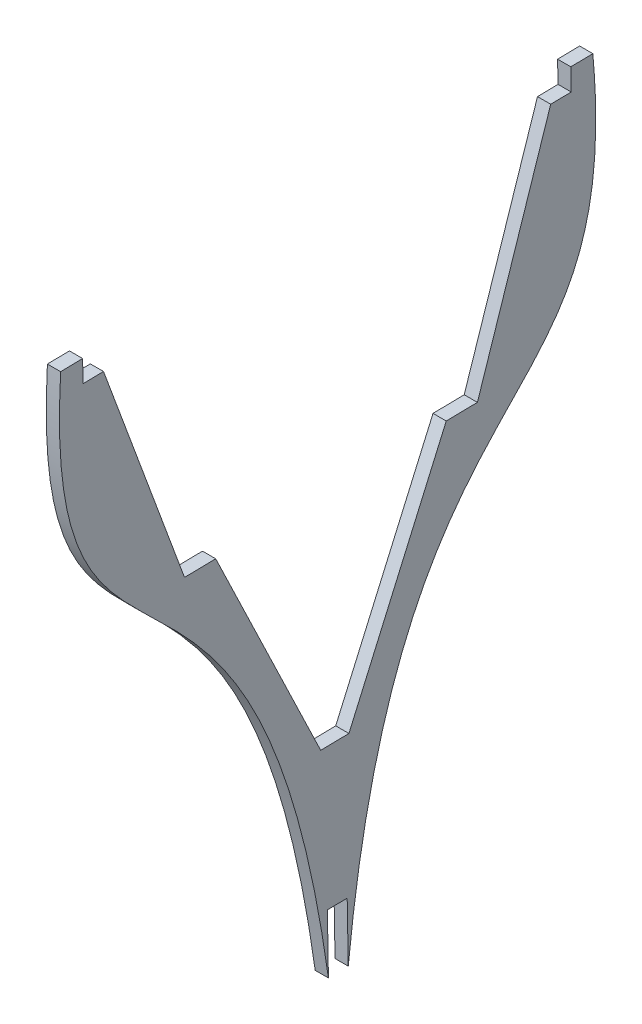
ISO-10303-21;
HEADER;
FILE_DESCRIPTION(('STEP AP214'),'2;1');
FILE_NAME('part.step','',(''),(''),'','','');
FILE_SCHEMA(('AUTOMOTIVE_DESIGN { 1 0 10303 214 1 1 1 1 }'));
ENDSEC;
DATA;
#1=APPLICATION_CONTEXT('core data for automotive mechanical design processes');
#2=APPLICATION_PROTOCOL_DEFINITION('international standard','automotive_design',2000,#1);
#3=PRODUCT_CONTEXT('',#1,'mechanical');
#4=PRODUCT('Part','Part','',(#3));
#5=PRODUCT_RELATED_PRODUCT_CATEGORY('part','',(#4));
#6=PRODUCT_DEFINITION_FORMATION('','',#4);
#7=PRODUCT_DEFINITION_CONTEXT('part definition',#1,'design');
#8=PRODUCT_DEFINITION('design','',#6,#7);
#9=PRODUCT_DEFINITION_SHAPE('','',#8);
#10=(LENGTH_UNIT() NAMED_UNIT(*) SI_UNIT(.MILLI.,.METRE.));
#11=(NAMED_UNIT(*) PLANE_ANGLE_UNIT() SI_UNIT($,.RADIAN.));
#12=(NAMED_UNIT(*) SI_UNIT($,.STERADIAN.) SOLID_ANGLE_UNIT());
#13=UNCERTAINTY_MEASURE_WITH_UNIT(LENGTH_MEASURE(1.E-05),#10,'distance_accuracy_value','');
#14=(GEOMETRIC_REPRESENTATION_CONTEXT(3) GLOBAL_UNCERTAINTY_ASSIGNED_CONTEXT((#13)) GLOBAL_UNIT_ASSIGNED_CONTEXT((#10,
#11,#12)) REPRESENTATION_CONTEXT('',''));
#15=CARTESIAN_POINT('',(0.,0.,0.));
#16=DIRECTION('',(0.,0.,1.));
#17=DIRECTION('',(1.,0.,0.));
#18=AXIS2_PLACEMENT_3D('',#15,#16,#17);
#19=CARTESIAN_POINT('',(6.,367.16431199332,127.304421382329));
#20=CARTESIAN_POINT('',(6.,203.132286892495,136.42399903936));
#21=CARTESIAN_POINT('',(6.,309.477254917197,24.8819117280946));
#22=CARTESIAN_POINT('',(6.,19.6255720457549,0.343298322938901));
#23=B_SPLINE_CURVE_WITH_KNOTS('',3,(#19,#20,#21,#22),.UNSPECIFIED.,.F.,.F.,(4,4),(0.,1.),.UNSPECIFIED.);
#24=DIRECTION('',(-1.,0.,0.));
#25=VECTOR('',#24,1.);
#26=SURFACE_OF_LINEAR_EXTRUSION('',#23,#25);
#27=CARTESIAN_POINT('',(0.,367.16431199332,127.304421382329));
#28=CARTESIAN_POINT('',(0.,203.132286892495,136.42399903936));
#29=CARTESIAN_POINT('',(0.,309.477254917197,24.8819117280946));
#30=CARTESIAN_POINT('',(0.,19.6255720457549,0.343298322938901));
#31=B_SPLINE_CURVE_WITH_KNOTS('',3,(#27,#28,#29,#30),.UNSPECIFIED.,.F.,.F.,(4,4),(0.,1.),.UNSPECIFIED.);
#32=CARTESIAN_POINT('',(0.,367.16431199332,127.304421382329));
#33=VERTEX_POINT('',#32);
#34=CARTESIAN_POINT('',(0.,67.9082996735934,5.68925595323594));
#35=VERTEX_POINT('',#34);
#36=EDGE_CURVE('E179',#33,#35,#31,.T.);
#37=ORIENTED_EDGE('',*,*,#36,.T.);
#38=DIRECTION('',(1.,0.,0.));
#39=VECTOR('',#38,1.);
#40=CARTESIAN_POINT('',(0.,67.9082996735934,5.68925595323594));
#41=LINE('',#40,#39);
#42=CARTESIAN_POINT('',(6.,67.9082996735934,5.68925595323594));
#43=VERTEX_POINT('',#42);
#44=EDGE_CURVE('E185',#35,#43,#41,.T.);
#45=ORIENTED_EDGE('',*,*,#44,.T.);
#46=CARTESIAN_POINT('',(6.,367.16431199332,127.304421382329));
#47=VERTEX_POINT('',#46);
#48=EDGE_CURVE('E219',#47,#43,#23,.T.);
#49=ORIENTED_EDGE('',*,*,#48,.F.);
#50=DIRECTION('',(-1.,0.,0.));
#51=VECTOR('',#50,1.);
#52=CARTESIAN_POINT('',(6.,367.16431199332,127.304421382329));
#53=LINE('',#52,#51);
#54=EDGE_CURVE('E175',#47,#33,#53,.T.);
#55=ORIENTED_EDGE('',*,*,#54,.T.);
#56=EDGE_LOOP('',(#37,#45,#49,#55));
#57=FACE_BOUND('',#56,.T.);
#58=ADVANCED_FACE('F33',(#57),#26,.F.);
#59=CARTESIAN_POINT('',(6.,19.6255720457549,0.343298322938901));
#60=CARTESIAN_POINT('',(6.,310.158145020655,-14.0430025163628));
#61=CARTESIAN_POINT('',(6.,207.779320371727,-129.236169542159));
#62=CARTESIAN_POINT('',(6.,371.392044852877,-114.385299427053));
#63=B_SPLINE_CURVE_WITH_KNOTS('',3,(#59,#60,#61,#62),.UNSPECIFIED.,.F.,.F.,(4,4),(0.,1.),.UNSPECIFIED.);
#64=DIRECTION('',(-1.,0.,0.));
#65=VECTOR('',#64,1.);
#66=SURFACE_OF_LINEAR_EXTRUSION('',#63,#65);
#67=CARTESIAN_POINT('',(6.,68.0657312582242,-3.31074404676406));
#68=VERTEX_POINT('',#67);
#69=CARTESIAN_POINT('',(6.,371.392044852877,-114.385299427053));
#70=VERTEX_POINT('',#69);
#71=EDGE_CURVE('E116',#68,#70,#63,.T.);
#72=ORIENTED_EDGE('',*,*,#71,.F.);
#73=DIRECTION('',(1.,0.,0.));
#74=VECTOR('',#73,1.);
#75=CARTESIAN_POINT('',(0.,68.0657312582242,-3.31074404676406));
#76=LINE('',#75,#74);
#77=CARTESIAN_POINT('',(0.,68.0657312582242,-3.31074404676406));
#78=VERTEX_POINT('',#77);
#79=EDGE_CURVE('E311',#78,#68,#76,.T.);
#80=ORIENTED_EDGE('',*,*,#79,.F.);
#81=CARTESIAN_POINT('',(0.,19.6255720457549,0.343298322938901));
#82=CARTESIAN_POINT('',(0.,310.158145020655,-14.0430025163628));
#83=CARTESIAN_POINT('',(0.,207.779320371727,-129.236169542159));
#84=CARTESIAN_POINT('',(0.,371.392044852877,-114.385299427053));
#85=B_SPLINE_CURVE_WITH_KNOTS('',3,(#81,#82,#83,#84),.UNSPECIFIED.,.F.,.F.,(4,4),(0.,1.),.UNSPECIFIED.);
#86=CARTESIAN_POINT('',(0.,371.392044852877,-114.385299427053));
#87=VERTEX_POINT('',#86);
#88=EDGE_CURVE('E184',#78,#87,#85,.T.);
#89=ORIENTED_EDGE('',*,*,#88,.T.);
#90=DIRECTION('',(-1.,0.,0.));
#91=VECTOR('',#90,1.);
#92=CARTESIAN_POINT('',(6.,371.392044852877,-114.385299427053));
#93=LINE('',#92,#91);
#94=EDGE_CURVE('E11',#70,#87,#93,.T.);
#95=ORIENTED_EDGE('',*,*,#94,.F.);
#96=EDGE_LOOP('',(#72,#80,#89,#95));
#97=FACE_BOUND('',#96,.T.);
#98=ADVANCED_FACE('F323',(#97),#66,.F.);
#99=CARTESIAN_POINT('',(6.,371.392044852877,-114.385299427053));
#100=DIRECTION('',(0.,-0.999847043101869,-0.0174897227093455));
#101=DIRECTION('',(0.,0.0174897227093455,-0.999847043101869));
#102=AXIS2_PLACEMENT_3D('',#99,#100,#101);
#103=PLANE('',#102);
#104=DIRECTION('',(0.,-0.0174897227093455,0.999847043101869));
#105=VECTOR('',#104,1.);
#106=CARTESIAN_POINT('',(0.,371.392044852877,-114.385299427053));
#107=LINE('',#106,#105);
#108=CARTESIAN_POINT('',(0.,371.217120869953,-104.385299427053));
#109=VERTEX_POINT('',#108);
#110=EDGE_CURVE('E192',#87,#109,#107,.T.);
#111=ORIENTED_EDGE('',*,*,#110,.T.);
#112=DIRECTION('',(-1.,0.,0.));
#113=VECTOR('',#112,1.);
#114=CARTESIAN_POINT('',(6.,371.217120869953,-104.385299427053));
#115=LINE('',#114,#113);
#116=CARTESIAN_POINT('',(6.,371.217120869953,-104.385299427053));
#117=VERTEX_POINT('',#116);
#118=EDGE_CURVE('E41',#117,#109,#115,.T.);
#119=ORIENTED_EDGE('',*,*,#118,.F.);
#120=DIRECTION('',(0.,-0.0174897227093455,0.999847043101869));
#121=VECTOR('',#120,1.);
#122=CARTESIAN_POINT('',(6.,371.392044852877,-114.385299427053));
#123=LINE('',#122,#121);
#124=EDGE_CURVE('E305',#70,#117,#123,.T.);
#125=ORIENTED_EDGE('',*,*,#124,.F.);
#126=ORIENTED_EDGE('',*,*,#94,.T.);
#127=EDGE_LOOP('',(#111,#119,#125,#126));
#128=FACE_BOUND('',#127,.T.);
#129=ADVANCED_FACE('F326',(#128),#103,.F.);
#130=CARTESIAN_POINT('',(6.,371.217120869953,-104.385299427053));
#131=DIRECTION('',(0.,0.0174897227093318,-0.999847043101869));
#132=DIRECTION('',(0.,0.999847043101869,0.0174897227093318));
#133=AXIS2_PLACEMENT_3D('',#130,#131,#132);
#134=PLANE('',#133);
#135=DIRECTION('',(0.,-0.999847043101869,-0.0174897227093318));
#136=VECTOR('',#135,1.);
#137=CARTESIAN_POINT('',(0.,371.217120869953,-104.385299427053));
#138=LINE('',#137,#136);
#139=CARTESIAN_POINT('',(0.,361.217120869953,-104.560223409976));
#140=VERTEX_POINT('',#139);
#141=EDGE_CURVE('E197',#109,#140,#138,.T.);
#142=ORIENTED_EDGE('',*,*,#141,.T.);
#143=DIRECTION('',(-1.,0.,0.));
#144=VECTOR('',#143,1.);
#145=CARTESIAN_POINT('',(6.,361.217120869953,-104.560223409976));
#146=LINE('',#145,#144);
#147=CARTESIAN_POINT('',(6.,361.217120869953,-104.560223409976));
#148=VERTEX_POINT('',#147);
#149=EDGE_CURVE('E244',#148,#140,#146,.T.);
#150=ORIENTED_EDGE('',*,*,#149,.F.);
#151=DIRECTION('',(0.,-0.999847043101869,-0.0174897227093318));
#152=VECTOR('',#151,1.);
#153=CARTESIAN_POINT('',(6.,371.217120869953,-104.385299427053));
#154=LINE('',#153,#152);
#155=EDGE_CURVE('E253',#117,#148,#154,.T.);
#156=ORIENTED_EDGE('',*,*,#155,.F.);
#157=ORIENTED_EDGE('',*,*,#118,.T.);
#158=EDGE_LOOP('',(#142,#150,#156,#157));
#159=FACE_BOUND('',#158,.T.);
#160=ADVANCED_FACE('F251',(#159),#134,.F.);
#161=CARTESIAN_POINT('',(6.,361.217120869953,-104.560223409976));
#162=DIRECTION('',(0.,-0.999847043101869,-0.0174897227093329));
#163=DIRECTION('',(0.,0.0174897227093329,-0.999847043101869));
#164=AXIS2_PLACEMENT_3D('',#161,#162,#163);
#165=PLANE('',#164);
#166=DIRECTION('',(0.,-0.0174897227093329,0.999847043101869));
#167=VECTOR('',#166,1.);
#168=CARTESIAN_POINT('',(0.,361.217120869953,-104.560223409976));
#169=LINE('',#168,#167);
#170=CARTESIAN_POINT('',(0.,361.054297197465,-95.2519702037626));
#171=VERTEX_POINT('',#170);
#172=EDGE_CURVE('E199',#140,#171,#169,.T.);
#173=ORIENTED_EDGE('',*,*,#172,.T.);
#174=DIRECTION('',(-1.,0.,0.));
#175=VECTOR('',#174,1.);
#176=CARTESIAN_POINT('',(6.,361.054297197465,-95.2519702037626));
#177=LINE('',#176,#175);
#178=CARTESIAN_POINT('',(6.,361.054297197465,-95.2519702037626));
#179=VERTEX_POINT('',#178);
#180=EDGE_CURVE('E241',#179,#171,#177,.T.);
#181=ORIENTED_EDGE('',*,*,#180,.F.);
#182=DIRECTION('',(0.,-0.0174897227093329,0.999847043101869));
#183=VECTOR('',#182,1.);
#184=CARTESIAN_POINT('',(6.,361.217120869953,-104.560223409976));
#185=LINE('',#184,#183);
#186=EDGE_CURVE('E275',#148,#179,#185,.T.);
#187=ORIENTED_EDGE('',*,*,#186,.F.);
#188=ORIENTED_EDGE('',*,*,#149,.T.);
#189=EDGE_LOOP('',(#173,#181,#187,#188));
#190=FACE_BOUND('',#189,.T.);
#191=ADVANCED_FACE('F266',(#190),#165,.F.);
#192=CARTESIAN_POINT('',(6.,361.054297197465,-95.2519702037626));
#193=DIRECTION('',(0.,-0.314151742452248,-0.949372783849535));
#194=DIRECTION('',(0.,0.949372783849536,-0.314151742452248));
#195=AXIS2_PLACEMENT_3D('',#192,#193,#194);
#196=PLANE('',#195);
#197=DIRECTION('',(0.,-0.949372783849535,0.314151742452248));
#198=VECTOR('',#197,1.);
#199=CARTESIAN_POINT('',(0.,361.054297197465,-95.2519702037626));
#200=LINE('',#199,#198);
#201=CARTESIAN_POINT('',(0.,260.456708777797,-61.9637738006715));
#202=VERTEX_POINT('',#201);
#203=EDGE_CURVE('E201',#171,#202,#200,.T.);
#204=ORIENTED_EDGE('',*,*,#203,.T.);
#205=DIRECTION('',(-1.,0.,0.));
#206=VECTOR('',#205,1.);
#207=CARTESIAN_POINT('',(6.,260.456708777797,-61.9637738006715));
#208=LINE('',#207,#206);
#209=CARTESIAN_POINT('',(6.,260.456708777797,-61.9637738006715));
#210=VERTEX_POINT('',#209);
#211=EDGE_CURVE('E238',#210,#202,#208,.T.);
#212=ORIENTED_EDGE('',*,*,#211,.F.);
#213=DIRECTION('',(0.,-0.949372783849535,0.314151742452248));
#214=VECTOR('',#213,1.);
#215=CARTESIAN_POINT('',(6.,361.054297197465,-95.2519702037626));
#216=LINE('',#215,#214);
#217=EDGE_CURVE('E272',#179,#210,#216,.T.);
#218=ORIENTED_EDGE('',*,*,#217,.F.);
#219=ORIENTED_EDGE('',*,*,#180,.T.);
#220=EDGE_LOOP('',(#204,#212,#218,#219));
#221=FACE_BOUND('',#220,.T.);
#222=ADVANCED_FACE('F270',(#221),#196,.F.);
#223=CARTESIAN_POINT('',(6.,260.456708777797,-61.9637738006715));
#224=DIRECTION('',(0.,-0.999847043101869,-0.0174897227093424));
#225=DIRECTION('',(0.,0.0174897227093424,-0.999847043101869));
#226=AXIS2_PLACEMENT_3D('',#223,#224,#225);
#227=PLANE('',#226);
#228=DIRECTION('',(0.,-0.0174897227093424,0.999847043101869));
#229=VECTOR('',#228,1.);
#230=CARTESIAN_POINT('',(0.,260.456708777797,-61.9637738006715));
#231=LINE('',#230,#229);
#232=CARTESIAN_POINT('',(0.,260.209100036734,-47.808554091817));
#233=VERTEX_POINT('',#232);
#234=EDGE_CURVE('E203',#202,#233,#231,.T.);
#235=ORIENTED_EDGE('',*,*,#234,.T.);
#236=DIRECTION('',(-1.,0.,0.));
#237=VECTOR('',#236,1.);
#238=CARTESIAN_POINT('',(6.,260.209100036734,-47.808554091817));
#239=LINE('',#238,#237);
#240=CARTESIAN_POINT('',(6.,260.209100036734,-47.808554091817));
#241=VERTEX_POINT('',#240);
#242=EDGE_CURVE('E235',#241,#233,#239,.T.);
#243=ORIENTED_EDGE('',*,*,#242,.F.);
#244=DIRECTION('',(0.,-0.0174897227093424,0.999847043101869));
#245=VECTOR('',#244,1.);
#246=CARTESIAN_POINT('',(6.,260.456708777797,-61.9637738006715));
#247=LINE('',#246,#245);
#248=EDGE_CURVE('E274',#210,#241,#247,.T.);
#249=ORIENTED_EDGE('',*,*,#248,.F.);
#250=ORIENTED_EDGE('',*,*,#211,.T.);
#251=EDGE_LOOP('',(#235,#243,#249,#250));
#252=FACE_BOUND('',#251,.T.);
#253=ADVANCED_FACE('F336',(#252),#227,.F.);
#254=CARTESIAN_POINT('',(6.,260.209100036734,-47.808554091817));
#255=DIRECTION('',(0.,-0.401560487209741,-0.915832503852028));
#256=DIRECTION('',(0.,0.915832503852029,-0.401560487209741));
#257=AXIS2_PLACEMENT_3D('',#254,#255,#256);
#258=PLANE('',#257);
#259=DIRECTION('',(0.,-0.915832503852029,0.401560487209741));
#260=VECTOR('',#259,1.);
#261=CARTESIAN_POINT('',(0.,260.209100036734,-47.808554091817));
#262=LINE('',#261,#260);
#263=CARTESIAN_POINT('',(0.,159.420775290955,-3.61640255784206));
#264=VERTEX_POINT('',#263);
#265=EDGE_CURVE('E205',#233,#264,#262,.T.);
#266=ORIENTED_EDGE('',*,*,#265,.T.);
#267=DIRECTION('',(-1.,0.,0.));
#268=VECTOR('',#267,1.);
#269=CARTESIAN_POINT('',(6.,159.420775290955,-3.61640255784206));
#270=LINE('',#269,#268);
#271=CARTESIAN_POINT('',(6.,159.420775290955,-3.61640255784206));
#272=VERTEX_POINT('',#271);
#273=EDGE_CURVE('E232',#272,#264,#270,.T.);
#274=ORIENTED_EDGE('',*,*,#273,.F.);
#275=DIRECTION('',(0.,-0.915832503852029,0.401560487209741));
#276=VECTOR('',#275,1.);
#277=CARTESIAN_POINT('',(6.,260.209100036734,-47.808554091817));
#278=LINE('',#277,#276);
#279=EDGE_CURVE('E277',#241,#272,#278,.T.);
#280=ORIENTED_EDGE('',*,*,#279,.F.);
#281=ORIENTED_EDGE('',*,*,#242,.T.);
#282=EDGE_LOOP('',(#266,#274,#280,#281));
#283=FACE_BOUND('',#282,.T.);
#284=ADVANCED_FACE('F339',(#283),#258,.F.);
#285=CARTESIAN_POINT('',(6.,159.196764314494,9.18978746353856));
#286=DIRECTION('',(0.,-0.999847043101869,-0.0174897227093282));
#287=DIRECTION('',(0.,0.0174897227093282,-0.999847043101869));
#288=AXIS2_PLACEMENT_3D('',#285,#286,#287);
#289=PLANE('',#288);
#290=DIRECTION('',(0.,-0.0174897227093282,0.999847043101869));
#291=VECTOR('',#290,1.);
#292=CARTESIAN_POINT('',(0.,159.196764314494,9.18978746353856));
#293=LINE('',#292,#291);
#294=CARTESIAN_POINT('',(0.,159.196764314494,9.18978746353856));
#295=VERTEX_POINT('',#294);
#296=EDGE_CURVE('E207',#264,#295,#293,.T.);
#297=ORIENTED_EDGE('',*,*,#296,.T.);
#298=DIRECTION('',(-1.,0.,0.));
#299=VECTOR('',#298,1.);
#300=CARTESIAN_POINT('',(6.,159.196764314494,9.18978746353856));
#301=LINE('',#300,#299);
#302=CARTESIAN_POINT('',(6.,159.196764314494,9.18978746353856));
#303=VERTEX_POINT('',#302);
#304=EDGE_CURVE('E229',#303,#295,#301,.T.);
#305=ORIENTED_EDGE('',*,*,#304,.F.);
#306=DIRECTION('',(0.,-0.0174897227093282,0.999847043101869));
#307=VECTOR('',#306,1.);
#308=CARTESIAN_POINT('',(6.,159.196764314494,9.18978746353856));
#309=LINE('',#308,#307);
#310=EDGE_CURVE('E283',#272,#303,#309,.T.);
#311=ORIENTED_EDGE('',*,*,#310,.F.);
#312=ORIENTED_EDGE('',*,*,#273,.T.);
#313=EDGE_LOOP('',(#297,#305,#311,#312));
#314=FACE_BOUND('',#313,.T.);
#315=ADVANCED_FACE('F343',(#314),#289,.F.);
#316=CARTESIAN_POINT('',(6.,258.377848189089,56.8798835393801));
#317=DIRECTION('',(0.,-0.433345233272278,0.901228000452824));
#318=DIRECTION('',(0.,-0.901228000452824,-0.433345233272278));
#319=AXIS2_PLACEMENT_3D('',#316,#317,#318);
#320=PLANE('',#319);
#321=DIRECTION('',(0.,0.901228000452824,0.433345233272278));
#322=VECTOR('',#321,1.);
#323=CARTESIAN_POINT('',(0.,258.377848189089,56.8798835393801));
#324=LINE('',#323,#322);
#325=CARTESIAN_POINT('',(0.,258.377848189089,56.8798835393801));
#326=VERTEX_POINT('',#325);
#327=EDGE_CURVE('E209',#295,#326,#324,.T.);
#328=ORIENTED_EDGE('',*,*,#327,.T.);
#329=DIRECTION('',(-1.,0.,0.));
#330=VECTOR('',#329,1.);
#331=CARTESIAN_POINT('',(6.,258.377848189089,56.8798835393801));
#332=LINE('',#331,#330);
#333=CARTESIAN_POINT('',(6.,258.377848189089,56.8798835393801));
#334=VERTEX_POINT('',#333);
#335=EDGE_CURVE('E226',#334,#326,#332,.T.);
#336=ORIENTED_EDGE('',*,*,#335,.F.);
#337=DIRECTION('',(0.,0.901228000452824,0.433345233272278));
#338=VECTOR('',#337,1.);
#339=CARTESIAN_POINT('',(6.,258.377848189089,56.8798835393801));
#340=LINE('',#339,#338);
#341=EDGE_CURVE('E285',#303,#334,#340,.T.);
#342=ORIENTED_EDGE('',*,*,#341,.F.);
#343=ORIENTED_EDGE('',*,*,#304,.T.);
#344=EDGE_LOOP('',(#328,#336,#342,#343));
#345=FACE_BOUND('',#344,.T.);
#346=ADVANCED_FACE('F347',(#345),#320,.F.);
#347=CARTESIAN_POINT('',(6.,258.130239448026,71.0351032482346));
#348=DIRECTION('',(0.,-0.999847043101869,-0.0174897227093345));
#349=DIRECTION('',(0.,0.0174897227093345,-0.999847043101869));
#350=AXIS2_PLACEMENT_3D('',#347,#348,#349);
#351=PLANE('',#350);
#352=DIRECTION('',(0.,-0.0174897227093345,0.999847043101869));
#353=VECTOR('',#352,1.);
#354=CARTESIAN_POINT('',(0.,258.130239448026,71.0351032482346));
#355=LINE('',#354,#353);
#356=CARTESIAN_POINT('',(0.,258.130239448026,71.0351032482346));
#357=VERTEX_POINT('',#356);
#358=EDGE_CURVE('E211',#326,#357,#355,.T.);
#359=ORIENTED_EDGE('',*,*,#358,.T.);
#360=DIRECTION('',(-1.,0.,0.));
#361=VECTOR('',#360,1.);
#362=CARTESIAN_POINT('',(6.,258.130239448026,71.0351032482346));
#363=LINE('',#362,#361);
#364=CARTESIAN_POINT('',(6.,258.130239448026,71.0351032482346));
#365=VERTEX_POINT('',#364);
#366=EDGE_CURVE('E223',#365,#357,#363,.T.);
#367=ORIENTED_EDGE('',*,*,#366,.F.);
#368=DIRECTION('',(0.,-0.0174897227093345,0.999847043101869));
#369=VECTOR('',#368,1.);
#370=CARTESIAN_POINT('',(6.,258.130239448026,71.0351032482346));
#371=LINE('',#370,#369);
#372=EDGE_CURVE('E287',#334,#365,#371,.T.);
#373=ORIENTED_EDGE('',*,*,#372,.F.);
#374=ORIENTED_EDGE('',*,*,#335,.T.);
#375=EDGE_LOOP('',(#359,#367,#373,#374));
#376=FACE_BOUND('',#375,.T.);
#377=ADVANCED_FACE('F293',(#376),#351,.F.);
#378=CARTESIAN_POINT('',(6.,357.502059648732,107.821244193192));
#379=DIRECTION('',(0.,-0.347163004448006,0.937804802900174));
#380=DIRECTION('',(0.,-0.937804802900174,-0.347163004448006));
#381=AXIS2_PLACEMENT_3D('',#378,#379,#380);
#382=PLANE('',#381);
#383=DIRECTION('',(0.,0.937804802900174,0.347163004448006));
#384=VECTOR('',#383,1.);
#385=CARTESIAN_POINT('',(0.,357.502059648732,107.821244193192));
#386=LINE('',#385,#384);
#387=CARTESIAN_POINT('',(0.,357.502059648732,107.821244193192));
#388=VERTEX_POINT('',#387);
#389=EDGE_CURVE('E213',#357,#388,#386,.T.);
#390=ORIENTED_EDGE('',*,*,#389,.T.);
#391=DIRECTION('',(-1.,0.,0.));
#392=VECTOR('',#391,1.);
#393=CARTESIAN_POINT('',(6.,357.502059648732,107.821244193192));
#394=LINE('',#393,#392);
#395=CARTESIAN_POINT('',(6.,357.502059648732,107.821244193192));
#396=VERTEX_POINT('',#395);
#397=EDGE_CURVE('E170',#396,#388,#394,.T.);
#398=ORIENTED_EDGE('',*,*,#397,.F.);
#399=DIRECTION('',(0.,0.937804802900174,0.347163004448006));
#400=VECTOR('',#399,1.);
#401=CARTESIAN_POINT('',(6.,357.502059648732,107.821244193192));
#402=LINE('',#401,#400);
#403=EDGE_CURVE('E158',#365,#396,#402,.T.);
#404=ORIENTED_EDGE('',*,*,#403,.F.);
#405=ORIENTED_EDGE('',*,*,#366,.T.);
#406=EDGE_LOOP('',(#390,#398,#404,#405));
#407=FACE_BOUND('',#406,.T.);
#408=ADVANCED_FACE('F297',(#407),#382,.F.);
#409=CARTESIAN_POINT('',(6.,357.339235976243,117.129497399406));
#410=DIRECTION('',(0.,-0.999847043101869,-0.0174897227093329));
#411=DIRECTION('',(0.,0.0174897227093329,-0.999847043101869));
#412=AXIS2_PLACEMENT_3D('',#409,#410,#411);
#413=PLANE('',#412);
#414=DIRECTION('',(0.,-0.0174897227093329,0.999847043101869));
#415=VECTOR('',#414,1.);
#416=CARTESIAN_POINT('',(0.,357.339235976243,117.129497399406));
#417=LINE('',#416,#415);
#418=CARTESIAN_POINT('',(0.,357.339235976243,117.129497399406));
#419=VERTEX_POINT('',#418);
#420=EDGE_CURVE('E167',#388,#419,#417,.T.);
#421=ORIENTED_EDGE('',*,*,#420,.T.);
#422=DIRECTION('',(-1.,0.,0.));
#423=VECTOR('',#422,1.);
#424=CARTESIAN_POINT('',(6.,357.339235976243,117.129497399406));
#425=LINE('',#424,#423);
#426=CARTESIAN_POINT('',(6.,357.339235976243,117.129497399406));
#427=VERTEX_POINT('',#426);
#428=EDGE_CURVE('E164',#427,#419,#425,.T.);
#429=ORIENTED_EDGE('',*,*,#428,.F.);
#430=DIRECTION('',(0.,-0.0174897227093329,0.999847043101869));
#431=VECTOR('',#430,1.);
#432=CARTESIAN_POINT('',(6.,357.339235976243,117.129497399406));
#433=LINE('',#432,#431);
#434=EDGE_CURVE('E151',#396,#427,#433,.T.);
#435=ORIENTED_EDGE('',*,*,#434,.F.);
#436=ORIENTED_EDGE('',*,*,#397,.T.);
#437=EDGE_LOOP('',(#421,#429,#435,#436));
#438=FACE_BOUND('',#437,.T.);
#439=ADVANCED_FACE('F165',(#438),#413,.F.);
#440=CARTESIAN_POINT('',(6.,367.339235976243,117.304421382329));
#441=DIRECTION('',(0.,-0.0174897227093344,0.999847043101869));
#442=DIRECTION('',(0.,-0.999847043101869,-0.0174897227093344));
#443=AXIS2_PLACEMENT_3D('',#440,#441,#442);
#444=PLANE('',#443);
#445=DIRECTION('',(0.,0.999847043101869,0.0174897227093344));
#446=VECTOR('',#445,1.);
#447=CARTESIAN_POINT('',(0.,367.339235976243,117.304421382329));
#448=LINE('',#447,#446);
#449=CARTESIAN_POINT('',(0.,367.339235976243,117.304421382329));
#450=VERTEX_POINT('',#449);
#451=EDGE_CURVE('E216',#419,#450,#448,.T.);
#452=ORIENTED_EDGE('',*,*,#451,.T.);
#453=DIRECTION('',(-1.,0.,0.));
#454=VECTOR('',#453,1.);
#455=CARTESIAN_POINT('',(6.,367.339235976243,117.304421382329));
#456=LINE('',#455,#454);
#457=CARTESIAN_POINT('',(6.,367.339235976243,117.304421382329));
#458=VERTEX_POINT('',#457);
#459=EDGE_CURVE('E171',#458,#450,#456,.T.);
#460=ORIENTED_EDGE('',*,*,#459,.F.);
#461=DIRECTION('',(0.,0.999847043101869,0.0174897227093344));
#462=VECTOR('',#461,1.);
#463=CARTESIAN_POINT('',(6.,367.339235976243,117.304421382329));
#464=LINE('',#463,#462);
#465=EDGE_CURVE('E155',#427,#458,#464,.T.);
#466=ORIENTED_EDGE('',*,*,#465,.F.);
#467=ORIENTED_EDGE('',*,*,#428,.T.);
#468=EDGE_LOOP('',(#452,#460,#466,#467));
#469=FACE_BOUND('',#468,.T.);
#470=ADVANCED_FACE('F173',(#469),#444,.F.);
#471=CARTESIAN_POINT('',(6.,367.16431199332,127.304421382329));
#472=DIRECTION('',(0.,-0.999847043101869,-0.0174897227093344));
#473=DIRECTION('',(0.,0.0174897227093344,-0.999847043101869));
#474=AXIS2_PLACEMENT_3D('',#471,#472,#473);
#475=PLANE('',#474);
#476=DIRECTION('',(0.,-0.0174897227093344,0.999847043101869));
#477=VECTOR('',#476,1.);
#478=CARTESIAN_POINT('',(0.,367.16431199332,127.304421382329));
#479=LINE('',#478,#477);
#480=EDGE_CURVE('E108',#450,#33,#479,.T.);
#481=ORIENTED_EDGE('',*,*,#480,.T.);
#482=ORIENTED_EDGE('',*,*,#54,.F.);
#483=DIRECTION('',(0.,-0.0174897227093344,0.999847043101869));
#484=VECTOR('',#483,1.);
#485=CARTESIAN_POINT('',(6.,367.16431199332,127.304421382329));
#486=LINE('',#485,#484);
#487=EDGE_CURVE('E57',#458,#47,#486,.T.);
#488=ORIENTED_EDGE('',*,*,#487,.F.);
#489=ORIENTED_EDGE('',*,*,#459,.T.);
#490=EDGE_LOOP('',(#481,#482,#488,#489));
#491=FACE_BOUND('',#490,.T.);
#492=ADVANCED_FACE('F299',(#491),#475,.F.);
#493=CARTESIAN_POINT('',(6.,240.577313683519,76.4456815009541));
#494=DIRECTION('',(-1.,0.,0.));
#495=DIRECTION('',(0.,0.,1.));
#496=AXIS2_PLACEMENT_3D('',#493,#494,#495);
#497=PLANE('',#496);
#498=ORIENTED_EDGE('',*,*,#48,.T.);
#499=DIRECTION('',(0.,-0.999847043101869,-0.0174897227093283));
#500=VECTOR('',#499,1.);
#501=CARTESIAN_POINT('',(6.,67.9082996735934,5.68925595323594));
#502=LINE('',#501,#500);
#503=CARTESIAN_POINT('',(6.,94.9082996735934,6.16155070712837));
#504=VERTEX_POINT('',#503);
#505=EDGE_CURVE('E499',#504,#43,#502,.T.);
#506=ORIENTED_EDGE('',*,*,#505,.F.);
#507=DIRECTION('',(0.,-0.0174897227093276,0.999847043101869));
#508=VECTOR('',#507,1.);
#509=CARTESIAN_POINT('',(6.,94.9082996735934,6.16155070712837));
#510=LINE('',#509,#508);
#511=CARTESIAN_POINT('',(6.,95.0657312582242,-2.83844929287163));
#512=VERTEX_POINT('',#511);
#513=EDGE_CURVE('E507',#512,#504,#510,.T.);
#514=ORIENTED_EDGE('',*,*,#513,.F.);
#515=DIRECTION('',(0.,0.999847043101869,0.0174897227093284));
#516=VECTOR('',#515,1.);
#517=CARTESIAN_POINT('',(6.,95.0657312582242,-2.83844929287163));
#518=LINE('',#517,#516);
#519=EDGE_CURVE('E511',#68,#512,#518,.T.);
#520=ORIENTED_EDGE('',*,*,#519,.F.);
#521=ORIENTED_EDGE('',*,*,#71,.T.);
#522=ORIENTED_EDGE('',*,*,#124,.T.);
#523=ORIENTED_EDGE('',*,*,#155,.T.);
#524=ORIENTED_EDGE('',*,*,#186,.T.);
#525=ORIENTED_EDGE('',*,*,#217,.T.);
#526=ORIENTED_EDGE('',*,*,#248,.T.);
#527=ORIENTED_EDGE('',*,*,#279,.T.);
#528=ORIENTED_EDGE('',*,*,#310,.T.);
#529=ORIENTED_EDGE('',*,*,#341,.T.);
#530=ORIENTED_EDGE('',*,*,#372,.T.);
#531=ORIENTED_EDGE('',*,*,#403,.T.);
#532=ORIENTED_EDGE('',*,*,#434,.T.);
#533=ORIENTED_EDGE('',*,*,#465,.T.);
#534=ORIENTED_EDGE('',*,*,#487,.T.);
#535=EDGE_LOOP('',(#498,#506,#514,#520,#521,#522,#523,#524,#525,#526,#527,#528,#529,#530,#531,
#532,#533,#534));
#536=FACE_BOUND('',#535,.T.);
#537=ADVANCED_FACE('F153',(#536),#497,.F.);
#538=CARTESIAN_POINT('',(0.,240.577313683519,76.4456815009541));
#539=DIRECTION('',(-1.,0.,0.));
#540=DIRECTION('',(0.,0.,1.));
#541=AXIS2_PLACEMENT_3D('',#538,#539,#540);
#542=PLANE('',#541);
#543=DIRECTION('',(0.,-0.999847043101869,-0.0174897227093283));
#544=VECTOR('',#543,1.);
#545=CARTESIAN_POINT('',(0.,67.9082996735934,5.68925595323594));
#546=LINE('',#545,#544);
#547=CARTESIAN_POINT('',(0.,94.9082996735934,6.16155070712837));
#548=VERTEX_POINT('',#547);
#549=EDGE_CURVE('E520',#548,#35,#546,.T.);
#550=ORIENTED_EDGE('',*,*,#549,.T.);
#551=ORIENTED_EDGE('',*,*,#36,.F.);
#552=ORIENTED_EDGE('',*,*,#480,.F.);
#553=ORIENTED_EDGE('',*,*,#451,.F.);
#554=ORIENTED_EDGE('',*,*,#420,.F.);
#555=ORIENTED_EDGE('',*,*,#389,.F.);
#556=ORIENTED_EDGE('',*,*,#358,.F.);
#557=ORIENTED_EDGE('',*,*,#327,.F.);
#558=ORIENTED_EDGE('',*,*,#296,.F.);
#559=ORIENTED_EDGE('',*,*,#265,.F.);
#560=ORIENTED_EDGE('',*,*,#234,.F.);
#561=ORIENTED_EDGE('',*,*,#203,.F.);
#562=ORIENTED_EDGE('',*,*,#172,.F.);
#563=ORIENTED_EDGE('',*,*,#141,.F.);
#564=ORIENTED_EDGE('',*,*,#110,.F.);
#565=ORIENTED_EDGE('',*,*,#88,.F.);
#566=DIRECTION('',(0.,0.999847043101869,0.0174897227093284));
#567=VECTOR('',#566,1.);
#568=CARTESIAN_POINT('',(0.,95.0657312582242,-2.83844929287163));
#569=LINE('',#568,#567);
#570=CARTESIAN_POINT('',(0.,95.0657312582241,-2.83844929287164));
#571=VERTEX_POINT('',#570);
#572=EDGE_CURVE('E506',#78,#571,#569,.T.);
#573=ORIENTED_EDGE('',*,*,#572,.T.);
#574=DIRECTION('',(0.,-0.0174897227093276,0.999847043101869));
#575=VECTOR('',#574,1.);
#576=CARTESIAN_POINT('',(0.,94.9082996735934,6.16155070712837));
#577=LINE('',#576,#575);
#578=EDGE_CURVE('E48',#571,#548,#577,.T.);
#579=ORIENTED_EDGE('',*,*,#578,.T.);
#580=EDGE_LOOP('',(#550,#551,#552,#553,#554,#555,#556,#557,#558,#559,#560,#561,#562,#563,#564,
#565,#573,#579));
#581=FACE_BOUND('',#580,.T.);
#582=ADVANCED_FACE('F260',(#581),#542,.T.);
#583=CARTESIAN_POINT('',(0.,67.9082996735934,5.68925595323594));
#584=DIRECTION('',(0.,-0.0174897227093283,0.999847043101869));
#585=DIRECTION('',(0.,-0.999847043101869,-0.0174897227093283));
#586=AXIS2_PLACEMENT_3D('',#583,#584,#585);
#587=PLANE('',#586);
#588=ORIENTED_EDGE('',*,*,#505,.T.);
#589=ORIENTED_EDGE('',*,*,#44,.F.);
#590=ORIENTED_EDGE('',*,*,#549,.F.);
#591=DIRECTION('',(1.,0.,0.));
#592=VECTOR('',#591,1.);
#593=CARTESIAN_POINT('',(0.,94.9082996735934,6.16155070712837));
#594=LINE('',#593,#592);
#595=EDGE_CURVE('E502',#548,#504,#594,.T.);
#596=ORIENTED_EDGE('',*,*,#595,.T.);
#597=EDGE_LOOP('',(#588,#589,#590,#596));
#598=FACE_BOUND('',#597,.T.);
#599=ADVANCED_FACE('F364',(#598),#587,.F.);
#600=CARTESIAN_POINT('',(0.,94.9082996735934,6.16155070712837));
#601=DIRECTION('',(0.,0.999847043101869,0.0174897227093276));
#602=DIRECTION('',(0.,-0.0174897227093276,0.999847043101869));
#603=AXIS2_PLACEMENT_3D('',#600,#601,#602);
#604=PLANE('',#603);
#605=ORIENTED_EDGE('',*,*,#513,.T.);
#606=ORIENTED_EDGE('',*,*,#595,.F.);
#607=ORIENTED_EDGE('',*,*,#578,.F.);
#608=DIRECTION('',(1.,0.,0.));
#609=VECTOR('',#608,1.);
#610=CARTESIAN_POINT('',(0.,95.0657312582242,-2.83844929287163));
#611=LINE('',#610,#609);
#612=EDGE_CURVE('E516',#571,#512,#611,.T.);
#613=ORIENTED_EDGE('',*,*,#612,.T.);
#614=EDGE_LOOP('',(#605,#606,#607,#613));
#615=FACE_BOUND('',#614,.T.);
#616=ADVANCED_FACE('F370',(#615),#604,.F.);
#617=CARTESIAN_POINT('',(0.,95.0657312582242,-2.83844929287163));
#618=DIRECTION('',(0.,0.0174897227093284,-0.999847043101869));
#619=DIRECTION('',(0.,0.999847043101869,0.0174897227093284));
#620=AXIS2_PLACEMENT_3D('',#617,#618,#619);
#621=PLANE('',#620);
#622=ORIENTED_EDGE('',*,*,#519,.T.);
#623=ORIENTED_EDGE('',*,*,#612,.F.);
#624=ORIENTED_EDGE('',*,*,#572,.F.);
#625=ORIENTED_EDGE('',*,*,#79,.T.);
#626=EDGE_LOOP('',(#622,#623,#624,#625));
#627=FACE_BOUND('',#626,.T.);
#628=ADVANCED_FACE('F367',(#627),#621,.F.);
#629=CLOSED_SHELL('',(#58,#98,#129,#160,#191,#222,#253,#284,#315,#346,#377,#408,#439,#470,#492,
#537,#582,#599,#616,#628));
#630=MANIFOLD_SOLID_BREP('B2',#629);
#631=ADVANCED_BREP_SHAPE_REPRESENTATION('',(#18,#630),#14);
#632=SHAPE_DEFINITION_REPRESENTATION(#9,#631);
ENDSEC;
END-ISO-10303-21;
